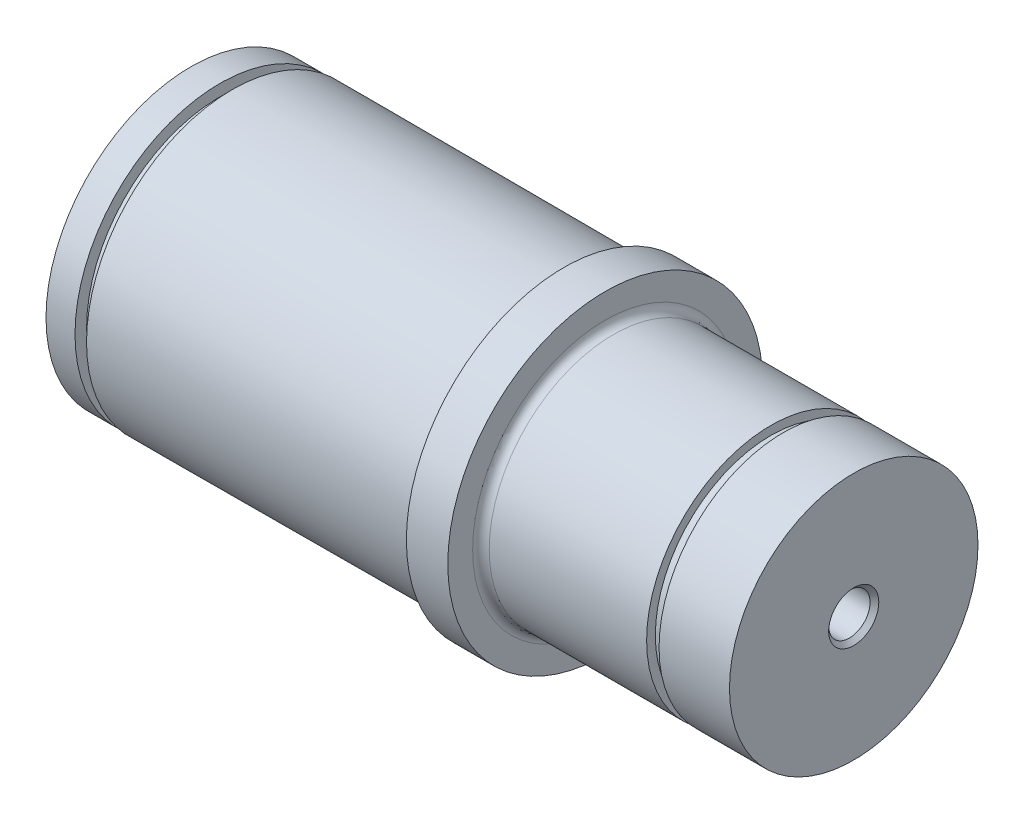
ISO-10303-21;
HEADER;
FILE_DESCRIPTION(('STEP AP214'),'2;1');
FILE_NAME('part.step','',(''),(''),'','','');
FILE_SCHEMA(('AUTOMOTIVE_DESIGN { 1 0 10303 214 1 1 1 1 }'));
ENDSEC;
DATA;
#1=APPLICATION_CONTEXT('core data for automotive mechanical design processes');
#2=APPLICATION_PROTOCOL_DEFINITION('international standard','automotive_design',2000,#1);
#3=PRODUCT_CONTEXT('',#1,'mechanical');
#4=PRODUCT('Part','Part','',(#3));
#5=PRODUCT_RELATED_PRODUCT_CATEGORY('part','',(#4));
#6=PRODUCT_DEFINITION_FORMATION('','',#4);
#7=PRODUCT_DEFINITION_CONTEXT('part definition',#1,'design');
#8=PRODUCT_DEFINITION('design','',#6,#7);
#9=PRODUCT_DEFINITION_SHAPE('','',#8);
#10=(LENGTH_UNIT() NAMED_UNIT(*) SI_UNIT(.MILLI.,.METRE.));
#11=(NAMED_UNIT(*) PLANE_ANGLE_UNIT() SI_UNIT($,.RADIAN.));
#12=(NAMED_UNIT(*) SI_UNIT($,.STERADIAN.) SOLID_ANGLE_UNIT());
#13=UNCERTAINTY_MEASURE_WITH_UNIT(LENGTH_MEASURE(1.E-05),#10,'distance_accuracy_value','');
#14=(GEOMETRIC_REPRESENTATION_CONTEXT(3) GLOBAL_UNCERTAINTY_ASSIGNED_CONTEXT((#13)) GLOBAL_UNIT_ASSIGNED_CONTEXT((#10,
#11,#12)) REPRESENTATION_CONTEXT('',''));
#15=CARTESIAN_POINT('',(0.,0.,0.));
#16=DIRECTION('',(0.,0.,1.));
#17=DIRECTION('',(1.,0.,0.));
#18=AXIS2_PLACEMENT_3D('',#15,#16,#17);
#19=CARTESIAN_POINT('',(0.,0.,0.));
#20=DIRECTION('',(-1.,0.,0.));
#21=DIRECTION('',(0.,0.,1.));
#22=AXIS2_PLACEMENT_3D('',#19,#20,#21);
#23=PLANE('',#22);
#24=CARTESIAN_POINT('',(0.,0.,0.));
#25=DIRECTION('',(1.,0.,0.));
#26=DIRECTION('',(0.,0.,-1.));
#27=AXIS2_PLACEMENT_3D('',#24,#25,#26);
#28=CIRCLE('',#27,2.49999999999998);
#29=CARTESIAN_POINT('',(0.,0.,-2.49999999999998));
#30=VERTEX_POINT('',#29);
#31=EDGE_CURVE('E89',#30,#30,#28,.T.);
#32=ORIENTED_EDGE('',*,*,#31,.T.);
#33=EDGE_LOOP('',(#32));
#34=FACE_BOUND('',#33,.T.);
#35=CARTESIAN_POINT('',(0.,0.,0.));
#36=DIRECTION('',(-1.,0.,0.));
#37=DIRECTION('',(0.,0.,1.));
#38=AXIS2_PLACEMENT_3D('',#35,#36,#37);
#39=CIRCLE('',#38,17.5);
#40=CARTESIAN_POINT('',(0.,0.,17.5));
#41=VERTEX_POINT('',#40);
#42=EDGE_CURVE('E86',#41,#41,#39,.T.);
#43=ORIENTED_EDGE('',*,*,#42,.T.);
#44=EDGE_LOOP('',(#43));
#45=FACE_BOUND('',#44,.T.);
#46=ADVANCED_FACE('F36',(#34,#45),#23,.T.);
#47=CARTESIAN_POINT('',(80.,0.,0.));
#48=DIRECTION('',(1.,0.,0.));
#49=DIRECTION('',(0.,0.,-1.));
#50=AXIS2_PLACEMENT_3D('',#47,#48,#49);
#51=PLANE('',#50);
#52=CARTESIAN_POINT('',(80.,0.,0.));
#53=DIRECTION('',(1.,0.,0.));
#54=DIRECTION('',(0.,0.,-1.));
#55=AXIS2_PLACEMENT_3D('',#52,#53,#54);
#56=CIRCLE('',#55,3.025);
#57=CARTESIAN_POINT('',(80.,0.,-3.025));
#58=VERTEX_POINT('',#57);
#59=EDGE_CURVE('E95',#58,#58,#56,.T.);
#60=ORIENTED_EDGE('',*,*,#59,.F.);
#61=EDGE_LOOP('',(#60));
#62=FACE_BOUND('',#61,.T.);
#63=CARTESIAN_POINT('',(80.,0.,0.));
#64=DIRECTION('',(-1.,0.,0.));
#65=DIRECTION('',(0.,0.,1.));
#66=AXIS2_PLACEMENT_3D('',#63,#64,#65);
#67=CIRCLE('',#66,15.);
#68=CARTESIAN_POINT('',(80.,0.,15.));
#69=VERTEX_POINT('',#68);
#70=EDGE_CURVE('E47',#69,#69,#67,.T.);
#71=ORIENTED_EDGE('',*,*,#70,.F.);
#72=EDGE_LOOP('',(#71));
#73=FACE_BOUND('',#72,.T.);
#74=ADVANCED_FACE('F101',(#62,#73),#51,.T.);
#75=CARTESIAN_POINT('',(0.,0.,0.));
#76=DIRECTION('',(-1.,0.,0.));
#77=DIRECTION('',(0.,0.,1.));
#78=AXIS2_PLACEMENT_3D('',#75,#76,#77);
#79=CYLINDRICAL_SURFACE('',#78,15.);
#80=ORIENTED_EDGE('',*,*,#70,.T.);
#81=EDGE_LOOP('',(#80));
#82=FACE_BOUND('',#81,.T.);
#83=CARTESIAN_POINT('',(71.5,0.,0.));
#84=DIRECTION('',(-1.,0.,0.));
#85=DIRECTION('',(0.,0.,1.));
#86=AXIS2_PLACEMENT_3D('',#83,#84,#85);
#87=CIRCLE('',#86,15.);
#88=CARTESIAN_POINT('',(71.5,0.,15.));
#89=VERTEX_POINT('',#88);
#90=EDGE_CURVE('E51',#89,#89,#87,.T.);
#91=ORIENTED_EDGE('',*,*,#90,.F.);
#92=EDGE_LOOP('',(#91));
#93=FACE_BOUND('',#92,.T.);
#94=ADVANCED_FACE('F104',(#82,#93),#79,.T.);
#95=CARTESIAN_POINT('',(71.5,0.,0.));
#96=DIRECTION('',(-1.,0.,0.));
#97=DIRECTION('',(0.,0.,1.));
#98=AXIS2_PLACEMENT_3D('',#95,#96,#97);
#99=PLANE('',#98);
#100=ORIENTED_EDGE('',*,*,#90,.T.);
#101=EDGE_LOOP('',(#100));
#102=FACE_BOUND('',#101,.T.);
#103=CARTESIAN_POINT('',(71.5,0.,0.));
#104=DIRECTION('',(-1.,0.,0.));
#105=DIRECTION('',(0.,0.,1.));
#106=AXIS2_PLACEMENT_3D('',#103,#104,#105);
#107=CIRCLE('',#106,13.95);
#108=CARTESIAN_POINT('',(71.5,0.,13.95));
#109=VERTEX_POINT('',#108);
#110=EDGE_CURVE('E56',#109,#109,#107,.T.);
#111=ORIENTED_EDGE('',*,*,#110,.F.);
#112=EDGE_LOOP('',(#111));
#113=FACE_BOUND('',#112,.T.);
#114=ADVANCED_FACE('F110',(#102,#113),#99,.T.);
#115=CARTESIAN_POINT('',(0.,0.,0.));
#116=DIRECTION('',(-1.,0.,0.));
#117=DIRECTION('',(0.,0.,1.));
#118=AXIS2_PLACEMENT_3D('',#115,#116,#117);
#119=CYLINDRICAL_SURFACE('',#118,13.95);
#120=ORIENTED_EDGE('',*,*,#110,.T.);
#121=EDGE_LOOP('',(#120));
#122=FACE_BOUND('',#121,.T.);
#123=CARTESIAN_POINT('',(70.,0.,0.));
#124=DIRECTION('',(-1.,0.,0.));
#125=DIRECTION('',(0.,0.,1.));
#126=AXIS2_PLACEMENT_3D('',#123,#124,#125);
#127=CIRCLE('',#126,13.95);
#128=CARTESIAN_POINT('',(70.,0.,13.95));
#129=VERTEX_POINT('',#128);
#130=EDGE_CURVE('E59',#129,#129,#127,.T.);
#131=ORIENTED_EDGE('',*,*,#130,.F.);
#132=EDGE_LOOP('',(#131));
#133=FACE_BOUND('',#132,.T.);
#134=ADVANCED_FACE('F116',(#122,#133),#119,.T.);
#135=CARTESIAN_POINT('',(70.,9.25185853854307E-13,0.));
#136=DIRECTION('',(1.,0.,0.));
#137=DIRECTION('',(0.,0.,-1.));
#138=AXIS2_PLACEMENT_3D('',#135,#136,#137);
#139=PLANE('',#138);
#140=ORIENTED_EDGE('',*,*,#130,.T.);
#141=EDGE_LOOP('',(#140));
#142=FACE_BOUND('',#141,.T.);
#143=CARTESIAN_POINT('',(70.,0.,0.));
#144=DIRECTION('',(-1.,0.,0.));
#145=DIRECTION('',(0.,0.,1.));
#146=AXIS2_PLACEMENT_3D('',#143,#144,#145);
#147=CIRCLE('',#146,15.);
#148=CARTESIAN_POINT('',(70.,0.,15.));
#149=VERTEX_POINT('',#148);
#150=EDGE_CURVE('E62',#149,#149,#147,.T.);
#151=ORIENTED_EDGE('',*,*,#150,.F.);
#152=EDGE_LOOP('',(#151));
#153=FACE_BOUND('',#152,.T.);
#154=ADVANCED_FACE('F122',(#142,#153),#139,.T.);
#155=CARTESIAN_POINT('',(0.,0.,0.));
#156=DIRECTION('',(-1.,0.,0.));
#157=DIRECTION('',(0.,0.,1.));
#158=AXIS2_PLACEMENT_3D('',#155,#156,#157);
#159=CYLINDRICAL_SURFACE('',#158,15.);
#160=CARTESIAN_POINT('',(51.,0.,0.));
#161=DIRECTION('',(1.,0.,0.));
#162=DIRECTION('',(0.,0.,-1.));
#163=AXIS2_PLACEMENT_3D('',#160,#161,#162);
#164=CIRCLE('',#163,15.);
#165=CARTESIAN_POINT('',(51.,0.,-15.));
#166=VERTEX_POINT('',#165);
#167=EDGE_CURVE('E10',#166,#166,#164,.T.);
#168=ORIENTED_EDGE('',*,*,#167,.T.);
#169=EDGE_LOOP('',(#168));
#170=FACE_BOUND('',#169,.T.);
#171=ORIENTED_EDGE('',*,*,#150,.T.);
#172=EDGE_LOOP('',(#171));
#173=FACE_BOUND('',#172,.T.);
#174=ADVANCED_FACE('F128',(#170,#173),#159,.T.);
#175=CARTESIAN_POINT('',(50.,0.,0.));
#176=DIRECTION('',(1.,0.,0.));
#177=DIRECTION('',(0.,0.,-1.));
#178=AXIS2_PLACEMENT_3D('',#175,#176,#177);
#179=PLANE('',#178);
#180=CARTESIAN_POINT('',(50.,0.,0.));
#181=DIRECTION('',(1.,0.,0.));
#182=DIRECTION('',(0.,0.,-1.));
#183=AXIS2_PLACEMENT_3D('',#180,#181,#182);
#184=CIRCLE('',#183,16.);
#185=CARTESIAN_POINT('',(50.,0.,-16.));
#186=VERTEX_POINT('',#185);
#187=EDGE_CURVE('E43',#186,#186,#184,.F.);
#188=ORIENTED_EDGE('',*,*,#187,.T.);
#189=EDGE_LOOP('',(#188));
#190=FACE_BOUND('',#189,.T.);
#191=CARTESIAN_POINT('',(50.,0.,0.));
#192=DIRECTION('',(-1.,0.,0.));
#193=DIRECTION('',(0.,0.,1.));
#194=AXIS2_PLACEMENT_3D('',#191,#192,#193);
#195=CIRCLE('',#194,19.);
#196=CARTESIAN_POINT('',(50.,0.,19.));
#197=VERTEX_POINT('',#196);
#198=EDGE_CURVE('E65',#197,#197,#195,.T.);
#199=ORIENTED_EDGE('',*,*,#198,.F.);
#200=EDGE_LOOP('',(#199));
#201=FACE_BOUND('',#200,.T.);
#202=ADVANCED_FACE('F133',(#190,#201),#179,.T.);
#203=CARTESIAN_POINT('',(0.,0.,0.));
#204=DIRECTION('',(-1.,0.,0.));
#205=DIRECTION('',(0.,0.,1.));
#206=AXIS2_PLACEMENT_3D('',#203,#204,#205);
#207=CYLINDRICAL_SURFACE('',#206,19.);
#208=ORIENTED_EDGE('',*,*,#198,.T.);
#209=EDGE_LOOP('',(#208));
#210=FACE_BOUND('',#209,.T.);
#211=CARTESIAN_POINT('',(45.,0.,0.));
#212=DIRECTION('',(-1.,0.,0.));
#213=DIRECTION('',(0.,0.,1.));
#214=AXIS2_PLACEMENT_3D('',#211,#212,#213);
#215=CIRCLE('',#214,19.);
#216=CARTESIAN_POINT('',(45.,0.,19.));
#217=VERTEX_POINT('',#216);
#218=EDGE_CURVE('E68',#217,#217,#215,.T.);
#219=ORIENTED_EDGE('',*,*,#218,.F.);
#220=EDGE_LOOP('',(#219));
#221=FACE_BOUND('',#220,.T.);
#222=ADVANCED_FACE('F138',(#210,#221),#207,.T.);
#223=CARTESIAN_POINT('',(45.,0.,0.));
#224=DIRECTION('',(-1.,0.,0.));
#225=DIRECTION('',(0.,0.,1.));
#226=AXIS2_PLACEMENT_3D('',#223,#224,#225);
#227=PLANE('',#226);
#228=ORIENTED_EDGE('',*,*,#218,.T.);
#229=EDGE_LOOP('',(#228));
#230=FACE_BOUND('',#229,.T.);
#231=CARTESIAN_POINT('',(45.,0.,0.));
#232=DIRECTION('',(-1.,0.,0.));
#233=DIRECTION('',(0.,0.,1.));
#234=AXIS2_PLACEMENT_3D('',#231,#232,#233);
#235=CIRCLE('',#234,17.5);
#236=CARTESIAN_POINT('',(45.,0.,17.5));
#237=VERTEX_POINT('',#236);
#238=EDGE_CURVE('E71',#237,#237,#235,.T.);
#239=ORIENTED_EDGE('',*,*,#238,.F.);
#240=EDGE_LOOP('',(#239));
#241=FACE_BOUND('',#240,.T.);
#242=ADVANCED_FACE('F175',(#230,#241),#227,.T.);
#243=CARTESIAN_POINT('',(5.00000000000001,0.,0.));
#244=DIRECTION('',(-1.,0.,0.));
#245=DIRECTION('',(0.,0.,1.));
#246=AXIS2_PLACEMENT_3D('',#243,#244,#245);
#247=CONICAL_SURFACE('',#246,17.61,0.00274999306773924);
#248=ORIENTED_EDGE('',*,*,#238,.T.);
#249=EDGE_LOOP('',(#248));
#250=FACE_BOUND('',#249,.T.);
#251=CARTESIAN_POINT('',(5.00000000000001,0.,0.));
#252=DIRECTION('',(-1.,0.,0.));
#253=DIRECTION('',(0.,0.,1.));
#254=AXIS2_PLACEMENT_3D('',#251,#252,#253);
#255=CIRCLE('',#254,17.61);
#256=CARTESIAN_POINT('',(5.00000000000001,0.,17.61));
#257=VERTEX_POINT('',#256);
#258=EDGE_CURVE('E74',#257,#257,#255,.T.);
#259=ORIENTED_EDGE('',*,*,#258,.F.);
#260=EDGE_LOOP('',(#259));
#261=FACE_BOUND('',#260,.T.);
#262=ADVANCED_FACE('F171',(#250,#261),#247,.T.);
#263=CARTESIAN_POINT('',(5.,0.,0.));
#264=DIRECTION('',(-1.,0.,0.));
#265=DIRECTION('',(0.,0.,1.));
#266=AXIS2_PLACEMENT_3D('',#263,#264,#265);
#267=PLANE('',#266);
#268=ORIENTED_EDGE('',*,*,#258,.T.);
#269=EDGE_LOOP('',(#268));
#270=FACE_BOUND('',#269,.T.);
#271=CARTESIAN_POINT('',(5.,0.,0.));
#272=DIRECTION('',(-1.,0.,0.));
#273=DIRECTION('',(0.,0.,1.));
#274=AXIS2_PLACEMENT_3D('',#271,#272,#273);
#275=CIRCLE('',#274,16.1);
#276=CARTESIAN_POINT('',(5.,0.,16.1));
#277=VERTEX_POINT('',#276);
#278=EDGE_CURVE('E77',#277,#277,#275,.T.);
#279=ORIENTED_EDGE('',*,*,#278,.F.);
#280=EDGE_LOOP('',(#279));
#281=FACE_BOUND('',#280,.T.);
#282=ADVANCED_FACE('F167',(#270,#281),#267,.T.);
#283=CARTESIAN_POINT('',(0.,0.,0.));
#284=DIRECTION('',(-1.,0.,0.));
#285=DIRECTION('',(0.,0.,1.));
#286=AXIS2_PLACEMENT_3D('',#283,#284,#285);
#287=CYLINDRICAL_SURFACE('',#286,16.1);
#288=ORIENTED_EDGE('',*,*,#278,.T.);
#289=EDGE_LOOP('',(#288));
#290=FACE_BOUND('',#289,.T.);
#291=CARTESIAN_POINT('',(3.5,0.,0.));
#292=DIRECTION('',(-1.,0.,0.));
#293=DIRECTION('',(0.,0.,1.));
#294=AXIS2_PLACEMENT_3D('',#291,#292,#293);
#295=CIRCLE('',#294,16.1);
#296=CARTESIAN_POINT('',(3.5,0.,16.1));
#297=VERTEX_POINT('',#296);
#298=EDGE_CURVE('E80',#297,#297,#295,.T.);
#299=ORIENTED_EDGE('',*,*,#298,.F.);
#300=EDGE_LOOP('',(#299));
#301=FACE_BOUND('',#300,.T.);
#302=ADVANCED_FACE('F159',(#290,#301),#287,.T.);
#303=CARTESIAN_POINT('',(3.5,0.,0.));
#304=DIRECTION('',(1.,0.,0.));
#305=DIRECTION('',(0.,0.,-1.));
#306=AXIS2_PLACEMENT_3D('',#303,#304,#305);
#307=PLANE('',#306);
#308=ORIENTED_EDGE('',*,*,#298,.T.);
#309=EDGE_LOOP('',(#308));
#310=FACE_BOUND('',#309,.T.);
#311=CARTESIAN_POINT('',(3.5,0.,0.));
#312=DIRECTION('',(-1.,0.,0.));
#313=DIRECTION('',(0.,0.,1.));
#314=AXIS2_PLACEMENT_3D('',#311,#312,#313);
#315=CIRCLE('',#314,17.5);
#316=CARTESIAN_POINT('',(3.5,0.,17.5));
#317=VERTEX_POINT('',#316);
#318=EDGE_CURVE('E83',#317,#317,#315,.T.);
#319=ORIENTED_EDGE('',*,*,#318,.F.);
#320=EDGE_LOOP('',(#319));
#321=FACE_BOUND('',#320,.T.);
#322=ADVANCED_FACE('F150',(#310,#321),#307,.T.);
#323=CARTESIAN_POINT('',(0.,0.,0.));
#324=DIRECTION('',(-1.,0.,0.));
#325=DIRECTION('',(0.,0.,1.));
#326=AXIS2_PLACEMENT_3D('',#323,#324,#325);
#327=CYLINDRICAL_SURFACE('',#326,17.5);
#328=ORIENTED_EDGE('',*,*,#318,.T.);
#329=EDGE_LOOP('',(#328));
#330=FACE_BOUND('',#329,.T.);
#331=ORIENTED_EDGE('',*,*,#42,.F.);
#332=EDGE_LOOP('',(#331));
#333=FACE_BOUND('',#332,.T.);
#334=ADVANCED_FACE('F148',(#330,#333),#327,.T.);
#335=CARTESIAN_POINT('',(51.,0.,0.));
#336=DIRECTION('',(1.,0.,0.));
#337=DIRECTION('',(0.,0.,-1.));
#338=AXIS2_PLACEMENT_3D('',#335,#336,#337);
#339=TOROIDAL_SURFACE('',#338,16.,1.);
#340=ORIENTED_EDGE('',*,*,#167,.F.);
#341=EDGE_LOOP('',(#340));
#342=FACE_BOUND('',#341,.T.);
#343=ORIENTED_EDGE('',*,*,#187,.F.);
#344=EDGE_LOOP('',(#343));
#345=FACE_BOUND('',#344,.T.);
#346=ADVANCED_FACE('F38',(#342,#345),#339,.F.);
#347=CARTESIAN_POINT('',(80.,0.,0.));
#348=DIRECTION('',(1.,0.,0.));
#349=DIRECTION('',(0.,0.,-1.));
#350=AXIS2_PLACEMENT_3D('',#347,#348,#349);
#351=CYLINDRICAL_SURFACE('',#350,2.49999999999999);
#352=ORIENTED_EDGE('',*,*,#31,.F.);
#353=EDGE_LOOP('',(#352));
#354=FACE_BOUND('',#353,.T.);
#355=CARTESIAN_POINT('',(79.475,0.,0.));
#356=DIRECTION('',(1.,0.,0.));
#357=DIRECTION('',(0.,0.,-1.));
#358=AXIS2_PLACEMENT_3D('',#355,#356,#357);
#359=CIRCLE('',#358,2.49999999999999);
#360=CARTESIAN_POINT('',(79.475,0.,-2.49999999999999));
#361=VERTEX_POINT('',#360);
#362=EDGE_CURVE('E92',#361,#361,#359,.T.);
#363=ORIENTED_EDGE('',*,*,#362,.T.);
#364=EDGE_LOOP('',(#363));
#365=FACE_BOUND('',#364,.T.);
#366=ADVANCED_FACE('F157',(#354,#365),#351,.F.);
#367=CARTESIAN_POINT('',(80.,0.,0.));
#368=DIRECTION('',(1.,0.,0.));
#369=DIRECTION('',(0.,0.,-1.));
#370=AXIS2_PLACEMENT_3D('',#367,#368,#369);
#371=CONICAL_SURFACE('',#370,3.025,0.785398163397447);
#372=ORIENTED_EDGE('',*,*,#362,.F.);
#373=EDGE_LOOP('',(#372));
#374=FACE_BOUND('',#373,.T.);
#375=ORIENTED_EDGE('',*,*,#59,.T.);
#376=EDGE_LOOP('',(#375));
#377=FACE_BOUND('',#376,.T.);
#378=ADVANCED_FACE('F99',(#374,#377),#371,.F.);
#379=CLOSED_SHELL('',(#46,#74,#94,#114,#134,#154,#174,#202,#222,#242,#262,#282,#302,#322,#334,
#346,#366,#378));
#380=MANIFOLD_SOLID_BREP('B2',#379);
#381=ADVANCED_BREP_SHAPE_REPRESENTATION('',(#18,#380),#14);
#382=SHAPE_DEFINITION_REPRESENTATION(#9,#381);
ENDSEC;
END-ISO-10303-21;
